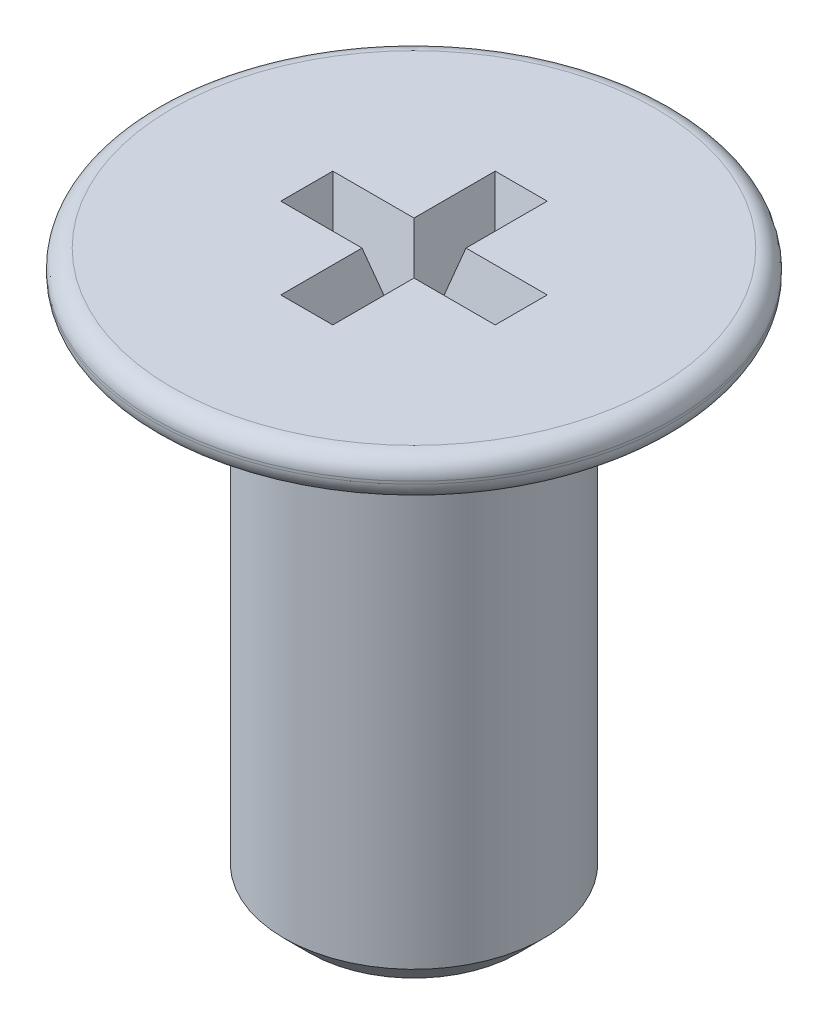
ISO-10303-21;
HEADER;
FILE_DESCRIPTION(('STEP AP214'),'2;1');
FILE_NAME('part.step','',(''),(''),'','','');
FILE_SCHEMA(('AUTOMOTIVE_DESIGN { 1 0 10303 214 1 1 1 1 }'));
ENDSEC;
DATA;
#1=APPLICATION_CONTEXT('core data for automotive mechanical design processes');
#2=APPLICATION_PROTOCOL_DEFINITION('international standard','automotive_design',2000,#1);
#3=PRODUCT_CONTEXT('',#1,'mechanical');
#4=PRODUCT('Part','Part','',(#3));
#5=PRODUCT_RELATED_PRODUCT_CATEGORY('part','',(#4));
#6=PRODUCT_DEFINITION_FORMATION('','',#4);
#7=PRODUCT_DEFINITION_CONTEXT('part definition',#1,'design');
#8=PRODUCT_DEFINITION('design','',#6,#7);
#9=PRODUCT_DEFINITION_SHAPE('','',#8);
#10=(LENGTH_UNIT() NAMED_UNIT(*) SI_UNIT(.MILLI.,.METRE.));
#11=(NAMED_UNIT(*) PLANE_ANGLE_UNIT() SI_UNIT($,.RADIAN.));
#12=(NAMED_UNIT(*) SI_UNIT($,.STERADIAN.) SOLID_ANGLE_UNIT());
#13=UNCERTAINTY_MEASURE_WITH_UNIT(LENGTH_MEASURE(1.E-05),#10,'distance_accuracy_value','');
#14=(GEOMETRIC_REPRESENTATION_CONTEXT(3) GLOBAL_UNCERTAINTY_ASSIGNED_CONTEXT((#13)) GLOBAL_UNIT_ASSIGNED_CONTEXT((#10,
#11,#12)) REPRESENTATION_CONTEXT('',''));
#15=CARTESIAN_POINT('',(0.,0.,0.));
#16=DIRECTION('',(0.,0.,1.));
#17=DIRECTION('',(1.,0.,0.));
#18=AXIS2_PLACEMENT_3D('',#15,#16,#17);
#19=CARTESIAN_POINT('',(0.2,4.3,-0.2));
#20=DIRECTION('',(0.,-0.258819045102521,-0.965925826289068));
#21=DIRECTION('',(0.,0.965925826289068,-0.258819045102521));
#22=AXIS2_PLACEMENT_3D('',#19,#20,#21);
#23=PLANE('',#22);
#24=DIRECTION('',(1.,0.,0.));
#25=VECTOR('',#24,1.);
#26=CARTESIAN_POINT('',(0.,4.3,-0.2));
#27=LINE('',#26,#25);
#28=CARTESIAN_POINT('',(0.2,4.3,-0.2));
#29=VERTEX_POINT('',#28);
#30=CARTESIAN_POINT('',(0.825,4.3,-0.2));
#31=VERTEX_POINT('',#30);
#32=EDGE_CURVE('E200',#29,#31,#27,.T.);
#33=ORIENTED_EDGE('',*,*,#32,.F.);
#34=DIRECTION('',(-0.250562807085732,-0.935113126531029,0.250562807085732));
#35=VECTOR('',#34,1.);
#36=CARTESIAN_POINT('',(0.2,4.3,-0.2));
#37=LINE('',#36,#35);
#38=CARTESIAN_POINT('',(0.,3.55358983848623,0.));
#39=VERTEX_POINT('',#38);
#40=EDGE_CURVE('E114',#29,#39,#37,.T.);
#41=ORIENTED_EDGE('',*,*,#40,.T.);
#42=DIRECTION('',(1.,0.,0.));
#43=VECTOR('',#42,1.);
#44=CARTESIAN_POINT('',(0.2,3.55358983848623,0.));
#45=LINE('',#44,#43);
#46=CARTESIAN_POINT('',(0.625,3.55358983848623,0.));
#47=VERTEX_POINT('',#46);
#48=EDGE_CURVE('E112',#39,#47,#45,.T.);
#49=ORIENTED_EDGE('',*,*,#48,.T.);
#50=DIRECTION('',(0.250562807085732,0.935113126531029,-0.250562807085732));
#51=VECTOR('',#50,1.);
#52=CARTESIAN_POINT('',(0.625,3.55358983848623,0.));
#53=LINE('',#52,#51);
#54=EDGE_CURVE('E100',#47,#31,#53,.T.);
#55=ORIENTED_EDGE('',*,*,#54,.T.);
#56=EDGE_LOOP('',(#33,#41,#49,#55));
#57=FACE_BOUND('',#56,.T.);
#58=ADVANCED_FACE('F17',(#57),#23,.F.);
#59=CARTESIAN_POINT('',(0.825,4.3,0.2));
#60=DIRECTION('',(0.965925826289068,-0.258819045102521,0.));
#61=DIRECTION('',(0.258819045102521,0.965925826289068,0.));
#62=AXIS2_PLACEMENT_3D('',#59,#60,#61);
#63=PLANE('',#62);
#64=ORIENTED_EDGE('',*,*,#54,.F.);
#65=DIRECTION('',(0.250562807085732,0.935113126531029,0.250562807085732));
#66=VECTOR('',#65,1.);
#67=CARTESIAN_POINT('',(0.625,3.55358983848623,0.));
#68=LINE('',#67,#66);
#69=CARTESIAN_POINT('',(0.825,4.3,0.2));
#70=VERTEX_POINT('',#69);
#71=EDGE_CURVE('E104',#47,#70,#68,.T.);
#72=ORIENTED_EDGE('',*,*,#71,.T.);
#73=DIRECTION('',(0.,0.,1.));
#74=VECTOR('',#73,1.);
#75=CARTESIAN_POINT('',(0.825,4.3,0.));
#76=LINE('',#75,#74);
#77=EDGE_CURVE('E107',#31,#70,#76,.T.);
#78=ORIENTED_EDGE('',*,*,#77,.F.);
#79=EDGE_LOOP('',(#64,#72,#78));
#80=FACE_BOUND('',#79,.T.);
#81=ADVANCED_FACE('F102',(#80),#63,.F.);
#82=CARTESIAN_POINT('',(0.2,4.3,0.2));
#83=DIRECTION('',(0.,-0.258819045102521,0.965925826289068));
#84=DIRECTION('',(0.,-0.965925826289068,-0.258819045102521));
#85=AXIS2_PLACEMENT_3D('',#82,#83,#84);
#86=PLANE('',#85);
#87=DIRECTION('',(0.250562807085732,0.935113126531029,0.250562807085732));
#88=VECTOR('',#87,1.);
#89=CARTESIAN_POINT('',(0.,3.55358983848623,0.));
#90=LINE('',#89,#88);
#91=CARTESIAN_POINT('',(0.2,4.3,0.2));
#92=VERTEX_POINT('',#91);
#93=EDGE_CURVE('E118',#39,#92,#90,.T.);
#94=ORIENTED_EDGE('',*,*,#93,.T.);
#95=DIRECTION('',(1.,0.,0.));
#96=VECTOR('',#95,1.);
#97=CARTESIAN_POINT('',(0.,4.3,0.2));
#98=LINE('',#97,#96);
#99=EDGE_CURVE('E122',#70,#92,#98,.F.);
#100=ORIENTED_EDGE('',*,*,#99,.F.);
#101=ORIENTED_EDGE('',*,*,#71,.F.);
#102=ORIENTED_EDGE('',*,*,#48,.F.);
#103=EDGE_LOOP('',(#94,#100,#101,#102));
#104=FACE_BOUND('',#103,.T.);
#105=ADVANCED_FACE('F120',(#104),#86,.F.);
#106=CARTESIAN_POINT('',(0.2,4.3,0.825));
#107=DIRECTION('',(0.965925826289068,-0.258819045102521,0.));
#108=DIRECTION('',(0.258819045102521,0.965925826289068,0.));
#109=AXIS2_PLACEMENT_3D('',#106,#107,#108);
#110=PLANE('',#109);
#111=DIRECTION('',(0.,0.,1.));
#112=VECTOR('',#111,1.);
#113=CARTESIAN_POINT('',(0.2,4.3,0.));
#114=LINE('',#113,#112);
#115=CARTESIAN_POINT('',(0.2,4.3,0.825));
#116=VERTEX_POINT('',#115);
#117=EDGE_CURVE('E225',#92,#116,#114,.T.);
#118=ORIENTED_EDGE('',*,*,#117,.F.);
#119=ORIENTED_EDGE('',*,*,#93,.F.);
#120=DIRECTION('',(0.,0.,1.));
#121=VECTOR('',#120,1.);
#122=CARTESIAN_POINT('',(0.,3.55358983848623,0.825));
#123=LINE('',#122,#121);
#124=CARTESIAN_POINT('',(0.,3.55358983848623,0.625));
#125=VERTEX_POINT('',#124);
#126=EDGE_CURVE('E217',#39,#125,#123,.T.);
#127=ORIENTED_EDGE('',*,*,#126,.T.);
#128=DIRECTION('',(0.250562807085732,0.935113126531029,0.250562807085732));
#129=VECTOR('',#128,1.);
#130=CARTESIAN_POINT('',(0.,3.55358983848623,0.625));
#131=LINE('',#130,#129);
#132=EDGE_CURVE('E95',#125,#116,#131,.T.);
#133=ORIENTED_EDGE('',*,*,#132,.T.);
#134=EDGE_LOOP('',(#118,#119,#127,#133));
#135=FACE_BOUND('',#134,.T.);
#136=ADVANCED_FACE('F226',(#135),#110,.F.);
#137=CARTESIAN_POINT('',(0.2,4.3,0.825));
#138=DIRECTION('',(0.,-0.258819045102521,0.965925826289068));
#139=DIRECTION('',(0.,-0.965925826289068,-0.258819045102521));
#140=AXIS2_PLACEMENT_3D('',#137,#138,#139);
#141=PLANE('',#140);
#142=ORIENTED_EDGE('',*,*,#132,.F.);
#143=DIRECTION('',(-0.250562807085732,0.935113126531029,0.250562807085732));
#144=VECTOR('',#143,1.);
#145=CARTESIAN_POINT('',(0.,3.55358983848623,0.625));
#146=LINE('',#145,#144);
#147=CARTESIAN_POINT('',(-0.2,4.3,0.825));
#148=VERTEX_POINT('',#147);
#149=EDGE_CURVE('E219',#125,#148,#146,.T.);
#150=ORIENTED_EDGE('',*,*,#149,.T.);
#151=DIRECTION('',(1.,0.,0.));
#152=VECTOR('',#151,1.);
#153=CARTESIAN_POINT('',(0.,4.3,0.825));
#154=LINE('',#153,#152);
#155=EDGE_CURVE('E229',#116,#148,#154,.F.);
#156=ORIENTED_EDGE('',*,*,#155,.F.);
#157=EDGE_LOOP('',(#142,#150,#156));
#158=FACE_BOUND('',#157,.T.);
#159=ADVANCED_FACE('F270',(#158),#141,.F.);
#160=CARTESIAN_POINT('',(-0.2,4.3,0.825));
#161=DIRECTION('',(-0.965925826289068,-0.258819045102521,0.));
#162=DIRECTION('',(0.258819045102521,-0.965925826289068,0.));
#163=AXIS2_PLACEMENT_3D('',#160,#161,#162);
#164=PLANE('',#163);
#165=DIRECTION('',(-0.250562807085732,0.935113126531029,0.250562807085732));
#166=VECTOR('',#165,1.);
#167=CARTESIAN_POINT('',(0.,3.55358983848623,0.));
#168=LINE('',#167,#166);
#169=CARTESIAN_POINT('',(-0.2,4.3,0.2));
#170=VERTEX_POINT('',#169);
#171=EDGE_CURVE('E215',#39,#170,#168,.T.);
#172=ORIENTED_EDGE('',*,*,#171,.T.);
#173=DIRECTION('',(0.,0.,1.));
#174=VECTOR('',#173,1.);
#175=CARTESIAN_POINT('',(-0.2,4.3,0.));
#176=LINE('',#175,#174);
#177=EDGE_CURVE('E269',#148,#170,#176,.F.);
#178=ORIENTED_EDGE('',*,*,#177,.F.);
#179=ORIENTED_EDGE('',*,*,#149,.F.);
#180=ORIENTED_EDGE('',*,*,#126,.F.);
#181=EDGE_LOOP('',(#172,#178,#179,#180));
#182=FACE_BOUND('',#181,.T.);
#183=ADVANCED_FACE('F267',(#182),#164,.F.);
#184=CARTESIAN_POINT('',(-0.825,4.3,0.2));
#185=DIRECTION('',(0.,-0.258819045102521,0.965925826289068));
#186=DIRECTION('',(0.,-0.965925826289068,-0.258819045102521));
#187=AXIS2_PLACEMENT_3D('',#184,#185,#186);
#188=PLANE('',#187);
#189=DIRECTION('',(1.,0.,0.));
#190=VECTOR('',#189,1.);
#191=CARTESIAN_POINT('',(0.,4.3,0.2));
#192=LINE('',#191,#190);
#193=CARTESIAN_POINT('',(-0.825,4.3,0.2));
#194=VERTEX_POINT('',#193);
#195=EDGE_CURVE('E263',#170,#194,#192,.F.);
#196=ORIENTED_EDGE('',*,*,#195,.F.);
#197=ORIENTED_EDGE('',*,*,#171,.F.);
#198=DIRECTION('',(1.,0.,0.));
#199=VECTOR('',#198,1.);
#200=CARTESIAN_POINT('',(-0.825,3.55358983848623,0.));
#201=LINE('',#200,#199);
#202=CARTESIAN_POINT('',(-0.625,3.55358983848623,0.));
#203=VERTEX_POINT('',#202);
#204=EDGE_CURVE('E208',#39,#203,#201,.F.);
#205=ORIENTED_EDGE('',*,*,#204,.T.);
#206=DIRECTION('',(-0.250562807085732,0.935113126531029,0.250562807085732));
#207=VECTOR('',#206,1.);
#208=CARTESIAN_POINT('',(-0.625,3.55358983848623,0.));
#209=LINE('',#208,#207);
#210=EDGE_CURVE('E213',#203,#194,#209,.T.);
#211=ORIENTED_EDGE('',*,*,#210,.T.);
#212=EDGE_LOOP('',(#196,#197,#205,#211));
#213=FACE_BOUND('',#212,.T.);
#214=ADVANCED_FACE('F260',(#213),#188,.F.);
#215=CARTESIAN_POINT('',(-0.825,4.3,0.2));
#216=DIRECTION('',(-0.965925826289068,-0.258819045102521,0.));
#217=DIRECTION('',(0.258819045102521,-0.965925826289068,0.));
#218=AXIS2_PLACEMENT_3D('',#215,#216,#217);
#219=PLANE('',#218);
#220=ORIENTED_EDGE('',*,*,#210,.F.);
#221=DIRECTION('',(-0.250562807085732,0.935113126531029,-0.250562807085732));
#222=VECTOR('',#221,1.);
#223=CARTESIAN_POINT('',(-0.625,3.55358983848623,0.));
#224=LINE('',#223,#222);
#225=CARTESIAN_POINT('',(-0.825,4.3,-0.2));
#226=VERTEX_POINT('',#225);
#227=EDGE_CURVE('E211',#203,#226,#224,.T.);
#228=ORIENTED_EDGE('',*,*,#227,.T.);
#229=DIRECTION('',(0.,0.,1.));
#230=VECTOR('',#229,1.);
#231=CARTESIAN_POINT('',(-0.825,4.3,0.));
#232=LINE('',#231,#230);
#233=EDGE_CURVE('E274',#194,#226,#232,.F.);
#234=ORIENTED_EDGE('',*,*,#233,.F.);
#235=EDGE_LOOP('',(#220,#228,#234));
#236=FACE_BOUND('',#235,.T.);
#237=ADVANCED_FACE('F408',(#236),#219,.F.);
#238=CARTESIAN_POINT('',(-0.825,4.3,-0.2));
#239=DIRECTION('',(0.,-0.258819045102521,-0.965925826289068));
#240=DIRECTION('',(0.,0.965925826289068,-0.258819045102521));
#241=AXIS2_PLACEMENT_3D('',#238,#239,#240);
#242=PLANE('',#241);
#243=DIRECTION('',(-0.250562807085732,0.935113126531029,-0.250562807085732));
#244=VECTOR('',#243,1.);
#245=CARTESIAN_POINT('',(0.,3.55358983848623,0.));
#246=LINE('',#245,#244);
#247=CARTESIAN_POINT('',(-0.2,4.3,-0.2));
#248=VERTEX_POINT('',#247);
#249=EDGE_CURVE('E206',#39,#248,#246,.T.);
#250=ORIENTED_EDGE('',*,*,#249,.T.);
#251=DIRECTION('',(1.,0.,0.));
#252=VECTOR('',#251,1.);
#253=CARTESIAN_POINT('',(0.,4.3,-0.2));
#254=LINE('',#253,#252);
#255=EDGE_CURVE('E255',#226,#248,#254,.T.);
#256=ORIENTED_EDGE('',*,*,#255,.F.);
#257=ORIENTED_EDGE('',*,*,#227,.F.);
#258=ORIENTED_EDGE('',*,*,#204,.F.);
#259=EDGE_LOOP('',(#250,#256,#257,#258));
#260=FACE_BOUND('',#259,.T.);
#261=ADVANCED_FACE('F253',(#260),#242,.F.);
#262=CARTESIAN_POINT('',(-0.2,4.3,-0.2));
#263=DIRECTION('',(-0.965925826289068,-0.258819045102521,0.));
#264=DIRECTION('',(0.258819045102521,-0.965925826289068,0.));
#265=AXIS2_PLACEMENT_3D('',#262,#263,#264);
#266=PLANE('',#265);
#267=DIRECTION('',(0.,0.,1.));
#268=VECTOR('',#267,1.);
#269=CARTESIAN_POINT('',(-0.2,4.3,0.));
#270=LINE('',#269,#268);
#271=CARTESIAN_POINT('',(-0.2,4.3,-0.825));
#272=VERTEX_POINT('',#271);
#273=EDGE_CURVE('E248',#248,#272,#270,.F.);
#274=ORIENTED_EDGE('',*,*,#273,.F.);
#275=ORIENTED_EDGE('',*,*,#249,.F.);
#276=DIRECTION('',(0.,0.,1.));
#277=VECTOR('',#276,1.);
#278=CARTESIAN_POINT('',(0.,3.55358983848623,-0.2));
#279=LINE('',#278,#277);
#280=CARTESIAN_POINT('',(0.,3.55358983848623,-0.625));
#281=VERTEX_POINT('',#280);
#282=EDGE_CURVE('E192',#39,#281,#279,.F.);
#283=ORIENTED_EDGE('',*,*,#282,.T.);
#284=DIRECTION('',(-0.250562807085732,0.935113126531029,-0.250562807085732));
#285=VECTOR('',#284,1.);
#286=CARTESIAN_POINT('',(0.,3.55358983848623,-0.625));
#287=LINE('',#286,#285);
#288=EDGE_CURVE('E204',#281,#272,#287,.T.);
#289=ORIENTED_EDGE('',*,*,#288,.T.);
#290=EDGE_LOOP('',(#274,#275,#283,#289));
#291=FACE_BOUND('',#290,.T.);
#292=ADVANCED_FACE('F245',(#291),#266,.F.);
#293=CARTESIAN_POINT('',(0.2,4.3,-0.825));
#294=DIRECTION('',(0.,-0.258819045102521,-0.965925826289068));
#295=DIRECTION('',(0.,0.965925826289068,-0.258819045102521));
#296=AXIS2_PLACEMENT_3D('',#293,#294,#295);
#297=PLANE('',#296);
#298=ORIENTED_EDGE('',*,*,#288,.F.);
#299=DIRECTION('',(0.250562807085732,0.935113126531029,-0.250562807085732));
#300=VECTOR('',#299,1.);
#301=CARTESIAN_POINT('',(0.,3.55358983848623,-0.625));
#302=LINE('',#301,#300);
#303=CARTESIAN_POINT('',(0.2,4.3,-0.825));
#304=VERTEX_POINT('',#303);
#305=EDGE_CURVE('E202',#281,#304,#302,.T.);
#306=ORIENTED_EDGE('',*,*,#305,.T.);
#307=DIRECTION('',(1.,0.,0.));
#308=VECTOR('',#307,1.);
#309=CARTESIAN_POINT('',(0.,4.3,-0.825));
#310=LINE('',#309,#308);
#311=EDGE_CURVE('E278',#272,#304,#310,.T.);
#312=ORIENTED_EDGE('',*,*,#311,.F.);
#313=EDGE_LOOP('',(#298,#306,#312));
#314=FACE_BOUND('',#313,.T.);
#315=ADVANCED_FACE('F304',(#314),#297,.F.);
#316=CARTESIAN_POINT('',(0.2,4.3,-0.2));
#317=DIRECTION('',(0.965925826289068,-0.258819045102521,0.));
#318=DIRECTION('',(0.258819045102521,0.965925826289068,0.));
#319=AXIS2_PLACEMENT_3D('',#316,#317,#318);
#320=PLANE('',#319);
#321=ORIENTED_EDGE('',*,*,#40,.F.);
#322=DIRECTION('',(0.,0.,1.));
#323=VECTOR('',#322,1.);
#324=CARTESIAN_POINT('',(0.2,4.3,0.));
#325=LINE('',#324,#323);
#326=EDGE_CURVE('E238',#304,#29,#325,.T.);
#327=ORIENTED_EDGE('',*,*,#326,.F.);
#328=ORIENTED_EDGE('',*,*,#305,.F.);
#329=ORIENTED_EDGE('',*,*,#282,.F.);
#330=EDGE_LOOP('',(#321,#327,#328,#329));
#331=FACE_BOUND('',#330,.T.);
#332=ADVANCED_FACE('F241',(#331),#320,.F.);
#333=CARTESIAN_POINT('',(0.,4.3,0.));
#334=DIRECTION('',(0.,1.,0.));
#335=DIRECTION('',(0.,0.,1.));
#336=AXIS2_PLACEMENT_3D('',#333,#334,#335);
#337=PLANE('',#336);
#338=ORIENTED_EDGE('',*,*,#311,.T.);
#339=ORIENTED_EDGE('',*,*,#326,.T.);
#340=ORIENTED_EDGE('',*,*,#32,.T.);
#341=ORIENTED_EDGE('',*,*,#77,.T.);
#342=ORIENTED_EDGE('',*,*,#99,.T.);
#343=ORIENTED_EDGE('',*,*,#117,.T.);
#344=ORIENTED_EDGE('',*,*,#155,.T.);
#345=ORIENTED_EDGE('',*,*,#177,.T.);
#346=ORIENTED_EDGE('',*,*,#195,.T.);
#347=ORIENTED_EDGE('',*,*,#233,.T.);
#348=ORIENTED_EDGE('',*,*,#255,.T.);
#349=ORIENTED_EDGE('',*,*,#273,.T.);
#350=EDGE_LOOP('',(#338,#339,#340,#341,#342,#343,#344,#345,#346,#347,#348,#349));
#351=FACE_BOUND('',#350,.T.);
#352=CARTESIAN_POINT('',(0.,4.3,0.));
#353=DIRECTION('',(0.,-1.,0.));
#354=DIRECTION('',(0.,0.,-1.));
#355=AXIS2_PLACEMENT_3D('',#352,#353,#354);
#356=CIRCLE('',#355,1.86);
#357=CARTESIAN_POINT('',(0.,4.3,-1.86));
#358=VERTEX_POINT('',#357);
#359=CARTESIAN_POINT('',(0.,4.3,1.86));
#360=VERTEX_POINT('',#359);
#361=EDGE_CURVE('E281',#358,#360,#356,.T.);
#362=ORIENTED_EDGE('',*,*,#361,.F.);
#363=CARTESIAN_POINT('',(0.,4.3,0.));
#364=DIRECTION('',(0.,-1.,0.));
#365=DIRECTION('',(0.,0.,1.));
#366=AXIS2_PLACEMENT_3D('',#363,#364,#365);
#367=CIRCLE('',#366,1.86);
#368=EDGE_CURVE('E172',#360,#358,#367,.T.);
#369=ORIENTED_EDGE('',*,*,#368,.F.);
#370=EDGE_LOOP('',(#362,#369));
#371=FACE_BOUND('',#370,.T.);
#372=ADVANCED_FACE('F180',(#351,#371),#337,.T.);
#373=CARTESIAN_POINT('',(0.,4.16,0.));
#374=DIRECTION('',(0.,1.,0.));
#375=DIRECTION('',(0.,0.,1.));
#376=AXIS2_PLACEMENT_3D('',#373,#374,#375);
#377=TOROIDAL_SURFACE('',#376,1.86,0.14);
#378=CARTESIAN_POINT('',(0.,4.16,0.));
#379=DIRECTION('',(0.,-1.,0.));
#380=DIRECTION('',(0.,0.,-1.));
#381=AXIS2_PLACEMENT_3D('',#378,#379,#380);
#382=CIRCLE('',#381,2.);
#383=CARTESIAN_POINT('',(0.,4.16,-2.));
#384=VERTEX_POINT('',#383);
#385=EDGE_CURVE('E169',#384,#384,#382,.T.);
#386=ORIENTED_EDGE('',*,*,#385,.F.);
#387=EDGE_LOOP('',(#386));
#388=FACE_BOUND('',#387,.T.);
#389=ORIENTED_EDGE('',*,*,#368,.T.);
#390=ORIENTED_EDGE('',*,*,#361,.T.);
#391=EDGE_LOOP('',(#389,#390));
#392=FACE_BOUND('',#391,.T.);
#393=ADVANCED_FACE('F176',(#388,#392),#377,.T.);
#394=CARTESIAN_POINT('',(0.,0.,0.));
#395=DIRECTION('',(0.,-1.,0.));
#396=DIRECTION('',(0.,0.,-1.));
#397=AXIS2_PLACEMENT_3D('',#394,#395,#396);
#398=CYLINDRICAL_SURFACE('',#397,2.);
#399=ORIENTED_EDGE('',*,*,#385,.T.);
#400=EDGE_LOOP('',(#399));
#401=FACE_BOUND('',#400,.T.);
#402=CARTESIAN_POINT('',(0.,4.14,0.));
#403=DIRECTION('',(0.,-1.,0.));
#404=DIRECTION('',(0.,0.,-1.));
#405=AXIS2_PLACEMENT_3D('',#402,#403,#404);
#406=CIRCLE('',#405,2.);
#407=CARTESIAN_POINT('',(0.,4.14,-2.));
#408=VERTEX_POINT('',#407);
#409=EDGE_CURVE('E161',#408,#408,#406,.T.);
#410=ORIENTED_EDGE('',*,*,#409,.F.);
#411=EDGE_LOOP('',(#410));
#412=FACE_BOUND('',#411,.T.);
#413=ADVANCED_FACE('F149',(#401,#412),#398,.T.);
#414=CARTESIAN_POINT('',(0.,4.14,0.));
#415=DIRECTION('',(0.,-1.,0.));
#416=DIRECTION('',(0.,0.,-1.));
#417=AXIS2_PLACEMENT_3D('',#414,#415,#416);
#418=TOROIDAL_SURFACE('',#417,1.86,0.14);
#419=ORIENTED_EDGE('',*,*,#409,.T.);
#420=EDGE_LOOP('',(#419));
#421=FACE_BOUND('',#420,.T.);
#422=CARTESIAN_POINT('',(0.,4.,0.));
#423=DIRECTION('',(0.,1.,0.));
#424=DIRECTION('',(0.,0.,-1.));
#425=AXIS2_PLACEMENT_3D('',#422,#423,#424);
#426=CIRCLE('',#425,1.86);
#427=CARTESIAN_POINT('',(0.,4.,1.86));
#428=VERTEX_POINT('',#427);
#429=CARTESIAN_POINT('',(0.,4.,-1.86));
#430=VERTEX_POINT('',#429);
#431=EDGE_CURVE('E36',#428,#430,#426,.F.);
#432=ORIENTED_EDGE('',*,*,#431,.F.);
#433=CARTESIAN_POINT('',(0.,4.,0.));
#434=DIRECTION('',(0.,1.,0.));
#435=DIRECTION('',(0.,0.,1.));
#436=AXIS2_PLACEMENT_3D('',#433,#434,#435);
#437=CIRCLE('',#436,1.86);
#438=EDGE_CURVE('E133',#430,#428,#437,.F.);
#439=ORIENTED_EDGE('',*,*,#438,.F.);
#440=EDGE_LOOP('',(#432,#439));
#441=FACE_BOUND('',#440,.T.);
#442=ADVANCED_FACE('F137',(#421,#441),#418,.T.);
#443=CARTESIAN_POINT('',(2.,4.,0.));
#444=DIRECTION('',(0.,-1.,0.));
#445=DIRECTION('',(0.,0.,-1.));
#446=AXIS2_PLACEMENT_3D('',#443,#444,#445);
#447=PLANE('',#446);
#448=CARTESIAN_POINT('',(0.,4.0000000000191,0.));
#449=DIRECTION('',(0.,1.,0.));
#450=DIRECTION('',(0.,0.,1.));
#451=AXIS2_PLACEMENT_3D('',#448,#449,#450);
#452=CIRCLE('',#451,1.10000000002231);
#453=CARTESIAN_POINT('',(0.,4.0000000000191,1.10000000002231));
#454=VERTEX_POINT('',#453);
#455=EDGE_CURVE('E129',#454,#454,#452,.F.);
#456=ORIENTED_EDGE('',*,*,#455,.F.);
#457=EDGE_LOOP('',(#456));
#458=FACE_BOUND('',#457,.T.);
#459=ORIENTED_EDGE('',*,*,#438,.T.);
#460=ORIENTED_EDGE('',*,*,#431,.T.);
#461=EDGE_LOOP('',(#459,#460));
#462=FACE_BOUND('',#461,.T.);
#463=ADVANCED_FACE('F148',(#458,#462),#447,.T.);
#464=CARTESIAN_POINT('',(1.,0.,0.));
#465=DIRECTION('',(0.,-1.,0.));
#466=DIRECTION('',(0.,0.,-1.));
#467=AXIS2_PLACEMENT_3D('',#464,#465,#466);
#468=PLANE('',#467);
#469=CARTESIAN_POINT('',(0.,5.6843418860808E-11,0.));
#470=DIRECTION('',(0.,1.,0.));
#471=DIRECTION('',(0.,0.,1.));
#472=AXIS2_PLACEMENT_3D('',#469,#470,#471);
#473=CIRCLE('',#472,0.800000000026557);
#474=CARTESIAN_POINT('',(0.,5.6843418860808E-11,0.800000000026557));
#475=VERTEX_POINT('',#474);
#476=EDGE_CURVE('E126',#475,#475,#473,.T.);
#477=ORIENTED_EDGE('',*,*,#476,.F.);
#478=EDGE_LOOP('',(#477));
#479=FACE_BOUND('',#478,.T.);
#480=ADVANCED_FACE('F319',(#479),#468,.T.);
#481=CARTESIAN_POINT('',(0.,4.0000000000191,0.));
#482=DIRECTION('',(0.,1.,0.));
#483=DIRECTION('',(0.,0.,1.));
#484=AXIS2_PLACEMENT_3D('',#481,#482,#483);
#485=CONICAL_SURFACE('',#484,1.10000000002231,0.197395559844415);
#486=ORIENTED_EDGE('',*,*,#455,.T.);
#487=EDGE_LOOP('',(#486));
#488=FACE_BOUND('',#487,.T.);
#489=CARTESIAN_POINT('',(0.,3.5,0.));
#490=DIRECTION('',(0.,-1.,0.));
#491=DIRECTION('',(0.,0.,-1.));
#492=AXIS2_PLACEMENT_3D('',#489,#490,#491);
#493=CIRCLE('',#492,1.);
#494=CARTESIAN_POINT('',(0.,3.5,-1.));
#495=VERTEX_POINT('',#494);
#496=EDGE_CURVE('E28',#495,#495,#493,.T.);
#497=ORIENTED_EDGE('',*,*,#496,.F.);
#498=EDGE_LOOP('',(#497));
#499=FACE_BOUND('',#498,.T.);
#500=ADVANCED_FACE('F313',(#488,#499),#485,.T.);
#501=CARTESIAN_POINT('',(0.,0.199999999892952,0.));
#502=DIRECTION('',(0.,1.,0.));
#503=DIRECTION('',(0.,0.,1.));
#504=AXIS2_PLACEMENT_3D('',#501,#502,#503);
#505=CONICAL_SURFACE('',#504,0.999999999862666,0.785398163397448);
#506=CARTESIAN_POINT('',(0.,0.199999999999999,0.));
#507=DIRECTION('',(0.,-1.,0.));
#508=DIRECTION('',(0.,0.,-1.));
#509=AXIS2_PLACEMENT_3D('',#506,#507,#508);
#510=CIRCLE('',#509,1.);
#511=CARTESIAN_POINT('',(0.,0.199999999999999,-1.));
#512=VERTEX_POINT('',#511);
#513=EDGE_CURVE('E11',#512,#512,#510,.F.);
#514=ORIENTED_EDGE('',*,*,#513,.F.);
#515=EDGE_LOOP('',(#514));
#516=FACE_BOUND('',#515,.T.);
#517=ORIENTED_EDGE('',*,*,#476,.T.);
#518=EDGE_LOOP('',(#517));
#519=FACE_BOUND('',#518,.T.);
#520=ADVANCED_FACE('F307',(#516,#519),#505,.T.);
#521=CARTESIAN_POINT('',(0.,0.,0.));
#522=DIRECTION('',(0.,-1.,0.));
#523=DIRECTION('',(0.,0.,-1.));
#524=AXIS2_PLACEMENT_3D('',#521,#522,#523);
#525=CYLINDRICAL_SURFACE('',#524,1.);
#526=ORIENTED_EDGE('',*,*,#513,.T.);
#527=EDGE_LOOP('',(#526));
#528=FACE_BOUND('',#527,.T.);
#529=ORIENTED_EDGE('',*,*,#496,.T.);
#530=EDGE_LOOP('',(#529));
#531=FACE_BOUND('',#530,.T.);
#532=ADVANCED_FACE('F305',(#528,#531),#525,.T.);
#533=CLOSED_SHELL('',(#58,#81,#105,#136,#159,#183,#214,#237,#261,#292,#315,#332,#372,#393,#413,
#442,#463,#480,#500,#520,#532));
#534=MANIFOLD_SOLID_BREP('B1',#533);
#535=ADVANCED_BREP_SHAPE_REPRESENTATION('',(#18,#534),#14);
#536=SHAPE_DEFINITION_REPRESENTATION(#9,#535);
ENDSEC;
END-ISO-10303-21;
